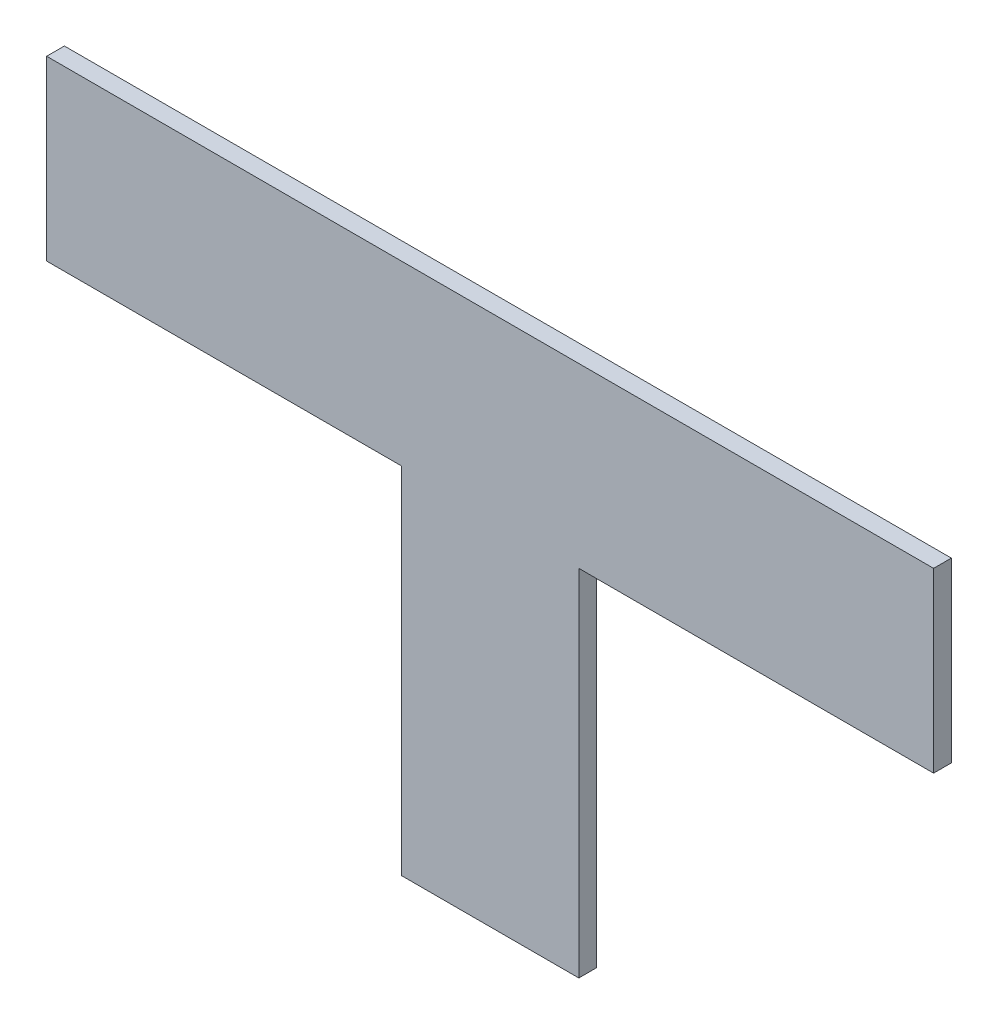
ISO-10303-21;
HEADER;
FILE_DESCRIPTION(('STEP AP214'),'2;1');
FILE_NAME('part.step','',(''),(''),'','','');
FILE_SCHEMA(('AUTOMOTIVE_DESIGN { 1 0 10303 214 1 1 1 1 }'));
ENDSEC;
DATA;
#1=APPLICATION_CONTEXT('core data for automotive mechanical design processes');
#2=APPLICATION_PROTOCOL_DEFINITION('international standard','automotive_design',2000,#1);
#3=PRODUCT_CONTEXT('',#1,'mechanical');
#4=PRODUCT('Part','Part','',(#3));
#5=PRODUCT_RELATED_PRODUCT_CATEGORY('part','',(#4));
#6=PRODUCT_DEFINITION_FORMATION('','',#4);
#7=PRODUCT_DEFINITION_CONTEXT('part definition',#1,'design');
#8=PRODUCT_DEFINITION('design','',#6,#7);
#9=PRODUCT_DEFINITION_SHAPE('','',#8);
#10=(LENGTH_UNIT() NAMED_UNIT(*) SI_UNIT(.MILLI.,.METRE.));
#11=(NAMED_UNIT(*) PLANE_ANGLE_UNIT() SI_UNIT($,.RADIAN.));
#12=(NAMED_UNIT(*) SI_UNIT($,.STERADIAN.) SOLID_ANGLE_UNIT());
#13=UNCERTAINTY_MEASURE_WITH_UNIT(LENGTH_MEASURE(1.E-05),#10,'distance_accuracy_value','');
#14=(GEOMETRIC_REPRESENTATION_CONTEXT(3) GLOBAL_UNCERTAINTY_ASSIGNED_CONTEXT((#13)) GLOBAL_UNIT_ASSIGNED_CONTEXT((#10,
#11,#12)) REPRESENTATION_CONTEXT('',''));
#15=CARTESIAN_POINT('',(0.,0.,0.));
#16=DIRECTION('',(0.,0.,1.));
#17=DIRECTION('',(1.,0.,0.));
#18=AXIS2_PLACEMENT_3D('',#15,#16,#17);
#19=CARTESIAN_POINT('',(50.,0.,2.));
#20=DIRECTION('',(1.,0.,0.));
#21=DIRECTION('',(0.,0.,-1.));
#22=AXIS2_PLACEMENT_3D('',#19,#20,#21);
#23=PLANE('',#22);
#24=DIRECTION('',(0.,-1.,0.));
#25=VECTOR('',#24,1.);
#26=CARTESIAN_POINT('',(50.,0.,0.));
#27=LINE('',#26,#25);
#28=CARTESIAN_POINT('',(50.,40.,0.));
#29=VERTEX_POINT('',#28);
#30=CARTESIAN_POINT('',(50.,20.,0.));
#31=VERTEX_POINT('',#30);
#32=EDGE_CURVE('E136',#29,#31,#27,.T.);
#33=ORIENTED_EDGE('',*,*,#32,.F.);
#34=DIRECTION('',(0.,0.,-1.));
#35=VECTOR('',#34,1.);
#36=CARTESIAN_POINT('',(50.,40.,2.));
#37=LINE('',#36,#35);
#38=CARTESIAN_POINT('',(50.,40.,2.));
#39=VERTEX_POINT('',#38);
#40=EDGE_CURVE('E11',#39,#29,#37,.T.);
#41=ORIENTED_EDGE('',*,*,#40,.F.);
#42=DIRECTION('',(0.,-1.,0.));
#43=VECTOR('',#42,1.);
#44=CARTESIAN_POINT('',(50.,0.,2.));
#45=LINE('',#44,#43);
#46=CARTESIAN_POINT('',(50.,20.,2.));
#47=VERTEX_POINT('',#46);
#48=EDGE_CURVE('E191',#39,#47,#45,.T.);
#49=ORIENTED_EDGE('',*,*,#48,.T.);
#50=DIRECTION('',(0.,0.,-1.));
#51=VECTOR('',#50,1.);
#52=CARTESIAN_POINT('',(50.,20.,2.));
#53=LINE('',#52,#51);
#54=EDGE_CURVE('E91',#47,#31,#53,.T.);
#55=ORIENTED_EDGE('',*,*,#54,.T.);
#56=EDGE_LOOP('',(#33,#41,#49,#55));
#57=FACE_BOUND('',#56,.T.);
#58=ADVANCED_FACE('F39',(#57),#23,.T.);
#59=CARTESIAN_POINT('',(0.,40.,2.));
#60=DIRECTION('',(0.,1.,0.));
#61=DIRECTION('',(0.,0.,1.));
#62=AXIS2_PLACEMENT_3D('',#59,#60,#61);
#63=PLANE('',#62);
#64=DIRECTION('',(1.,0.,0.));
#65=VECTOR('',#64,1.);
#66=CARTESIAN_POINT('',(0.,40.,0.));
#67=LINE('',#66,#65);
#68=CARTESIAN_POINT('',(-50.,40.,0.));
#69=VERTEX_POINT('',#68);
#70=EDGE_CURVE('E140',#69,#29,#67,.T.);
#71=ORIENTED_EDGE('',*,*,#70,.F.);
#72=DIRECTION('',(0.,0.,-1.));
#73=VECTOR('',#72,1.);
#74=CARTESIAN_POINT('',(-50.,40.,2.));
#75=LINE('',#74,#73);
#76=CARTESIAN_POINT('',(-50.,40.,2.));
#77=VERTEX_POINT('',#76);
#78=EDGE_CURVE('E48',#77,#69,#75,.T.);
#79=ORIENTED_EDGE('',*,*,#78,.F.);
#80=DIRECTION('',(1.,0.,0.));
#81=VECTOR('',#80,1.);
#82=CARTESIAN_POINT('',(0.,40.,2.));
#83=LINE('',#82,#81);
#84=EDGE_CURVE('E187',#77,#39,#83,.T.);
#85=ORIENTED_EDGE('',*,*,#84,.T.);
#86=ORIENTED_EDGE('',*,*,#40,.T.);
#87=EDGE_LOOP('',(#71,#79,#85,#86));
#88=FACE_BOUND('',#87,.T.);
#89=ADVANCED_FACE('F186',(#88),#63,.T.);
#90=CARTESIAN_POINT('',(-50.,0.,2.));
#91=DIRECTION('',(1.,0.,0.));
#92=DIRECTION('',(0.,0.,-1.));
#93=AXIS2_PLACEMENT_3D('',#90,#91,#92);
#94=PLANE('',#93);
#95=DIRECTION('',(0.,-1.,0.));
#96=VECTOR('',#95,1.);
#97=CARTESIAN_POINT('',(-50.,0.,0.));
#98=LINE('',#97,#96);
#99=CARTESIAN_POINT('',(-50.,20.,0.));
#100=VERTEX_POINT('',#99);
#101=EDGE_CURVE('E144',#69,#100,#98,.T.);
#102=ORIENTED_EDGE('',*,*,#101,.T.);
#103=DIRECTION('',(0.,0.,-1.));
#104=VECTOR('',#103,1.);
#105=CARTESIAN_POINT('',(-50.,20.,2.));
#106=LINE('',#105,#104);
#107=CARTESIAN_POINT('',(-50.,20.,2.));
#108=VERTEX_POINT('',#107);
#109=EDGE_CURVE('E169',#108,#100,#106,.T.);
#110=ORIENTED_EDGE('',*,*,#109,.F.);
#111=DIRECTION('',(0.,-1.,0.));
#112=VECTOR('',#111,1.);
#113=CARTESIAN_POINT('',(-50.,0.,2.));
#114=LINE('',#113,#112);
#115=EDGE_CURVE('E178',#77,#108,#114,.T.);
#116=ORIENTED_EDGE('',*,*,#115,.F.);
#117=ORIENTED_EDGE('',*,*,#78,.T.);
#118=EDGE_LOOP('',(#102,#110,#116,#117));
#119=FACE_BOUND('',#118,.T.);
#120=ADVANCED_FACE('F176',(#119),#94,.F.);
#121=CARTESIAN_POINT('',(0.,20.,2.));
#122=DIRECTION('',(0.,1.,0.));
#123=DIRECTION('',(0.,0.,1.));
#124=AXIS2_PLACEMENT_3D('',#121,#122,#123);
#125=PLANE('',#124);
#126=DIRECTION('',(1.,0.,0.));
#127=VECTOR('',#126,1.);
#128=CARTESIAN_POINT('',(0.,20.,0.));
#129=LINE('',#128,#127);
#130=CARTESIAN_POINT('',(-10.,20.,0.));
#131=VERTEX_POINT('',#130);
#132=EDGE_CURVE('E147',#100,#131,#129,.T.);
#133=ORIENTED_EDGE('',*,*,#132,.T.);
#134=DIRECTION('',(0.,0.,-1.));
#135=VECTOR('',#134,1.);
#136=CARTESIAN_POINT('',(-10.,20.,2.));
#137=LINE('',#136,#135);
#138=CARTESIAN_POINT('',(-10.,20.,2.));
#139=VERTEX_POINT('',#138);
#140=EDGE_CURVE('E166',#139,#131,#137,.T.);
#141=ORIENTED_EDGE('',*,*,#140,.F.);
#142=DIRECTION('',(1.,0.,0.));
#143=VECTOR('',#142,1.);
#144=CARTESIAN_POINT('',(0.,20.,2.));
#145=LINE('',#144,#143);
#146=EDGE_CURVE('E133',#108,#139,#145,.T.);
#147=ORIENTED_EDGE('',*,*,#146,.F.);
#148=ORIENTED_EDGE('',*,*,#109,.T.);
#149=EDGE_LOOP('',(#133,#141,#147,#148));
#150=FACE_BOUND('',#149,.T.);
#151=ADVANCED_FACE('F206',(#150),#125,.F.);
#152=CARTESIAN_POINT('',(-10.,0.,2.));
#153=DIRECTION('',(-1.,0.,0.));
#154=DIRECTION('',(0.,0.,1.));
#155=AXIS2_PLACEMENT_3D('',#152,#153,#154);
#156=PLANE('',#155);
#157=DIRECTION('',(0.,1.,0.));
#158=VECTOR('',#157,1.);
#159=CARTESIAN_POINT('',(-10.,0.,0.));
#160=LINE('',#159,#158);
#161=CARTESIAN_POINT('',(-10.,-20.,0.));
#162=VERTEX_POINT('',#161);
#163=EDGE_CURVE('E151',#162,#131,#160,.T.);
#164=ORIENTED_EDGE('',*,*,#163,.F.);
#165=DIRECTION('',(0.,0.,-1.));
#166=VECTOR('',#165,1.);
#167=CARTESIAN_POINT('',(-10.,-20.,2.));
#168=LINE('',#167,#166);
#169=CARTESIAN_POINT('',(-10.,-20.,2.));
#170=VERTEX_POINT('',#169);
#171=EDGE_CURVE('E125',#170,#162,#168,.T.);
#172=ORIENTED_EDGE('',*,*,#171,.F.);
#173=DIRECTION('',(0.,1.,0.));
#174=VECTOR('',#173,1.);
#175=CARTESIAN_POINT('',(-10.,0.,2.));
#176=LINE('',#175,#174);
#177=EDGE_CURVE('E116',#170,#139,#176,.T.);
#178=ORIENTED_EDGE('',*,*,#177,.T.);
#179=ORIENTED_EDGE('',*,*,#140,.T.);
#180=EDGE_LOOP('',(#164,#172,#178,#179));
#181=FACE_BOUND('',#180,.T.);
#182=ADVANCED_FACE('F202',(#181),#156,.T.);
#183=CARTESIAN_POINT('',(0.,-20.,2.));
#184=DIRECTION('',(0.,1.,0.));
#185=DIRECTION('',(0.,0.,1.));
#186=AXIS2_PLACEMENT_3D('',#183,#184,#185);
#187=PLANE('',#186);
#188=DIRECTION('',(1.,0.,0.));
#189=VECTOR('',#188,1.);
#190=CARTESIAN_POINT('',(0.,-20.,0.));
#191=LINE('',#190,#189);
#192=CARTESIAN_POINT('',(10.,-20.,0.));
#193=VERTEX_POINT('',#192);
#194=EDGE_CURVE('E123',#162,#193,#191,.T.);
#195=ORIENTED_EDGE('',*,*,#194,.T.);
#196=DIRECTION('',(0.,0.,-1.));
#197=VECTOR('',#196,1.);
#198=CARTESIAN_POINT('',(10.,-20.,2.));
#199=LINE('',#198,#197);
#200=CARTESIAN_POINT('',(10.,-20.,2.));
#201=VERTEX_POINT('',#200);
#202=EDGE_CURVE('E120',#201,#193,#199,.T.);
#203=ORIENTED_EDGE('',*,*,#202,.F.);
#204=DIRECTION('',(1.,0.,0.));
#205=VECTOR('',#204,1.);
#206=CARTESIAN_POINT('',(0.,-20.,2.));
#207=LINE('',#206,#205);
#208=EDGE_CURVE('E110',#170,#201,#207,.T.);
#209=ORIENTED_EDGE('',*,*,#208,.F.);
#210=ORIENTED_EDGE('',*,*,#171,.T.);
#211=EDGE_LOOP('',(#195,#203,#209,#210));
#212=FACE_BOUND('',#211,.T.);
#213=ADVANCED_FACE('F121',(#212),#187,.F.);
#214=CARTESIAN_POINT('',(10.,0.,2.));
#215=DIRECTION('',(-1.,0.,0.));
#216=DIRECTION('',(0.,0.,1.));
#217=AXIS2_PLACEMENT_3D('',#214,#215,#216);
#218=PLANE('',#217);
#219=DIRECTION('',(0.,1.,0.));
#220=VECTOR('',#219,1.);
#221=CARTESIAN_POINT('',(10.,0.,0.));
#222=LINE('',#221,#220);
#223=CARTESIAN_POINT('',(10.,20.,0.));
#224=VERTEX_POINT('',#223);
#225=EDGE_CURVE('E84',#193,#224,#222,.T.);
#226=ORIENTED_EDGE('',*,*,#225,.T.);
#227=DIRECTION('',(0.,0.,-1.));
#228=VECTOR('',#227,1.);
#229=CARTESIAN_POINT('',(10.,20.,2.));
#230=LINE('',#229,#228);
#231=CARTESIAN_POINT('',(10.,20.,2.));
#232=VERTEX_POINT('',#231);
#233=EDGE_CURVE('E126',#232,#224,#230,.T.);
#234=ORIENTED_EDGE('',*,*,#233,.F.);
#235=DIRECTION('',(0.,1.,0.));
#236=VECTOR('',#235,1.);
#237=CARTESIAN_POINT('',(10.,0.,2.));
#238=LINE('',#237,#236);
#239=EDGE_CURVE('E114',#201,#232,#238,.T.);
#240=ORIENTED_EDGE('',*,*,#239,.F.);
#241=ORIENTED_EDGE('',*,*,#202,.T.);
#242=EDGE_LOOP('',(#226,#234,#240,#241));
#243=FACE_BOUND('',#242,.T.);
#244=ADVANCED_FACE('F128',(#243),#218,.F.);
#245=EDGE_CURVE('E152',#224,#31,#129,.T.);
#246=ORIENTED_EDGE('',*,*,#245,.T.);
#247=ORIENTED_EDGE('',*,*,#54,.F.);
#248=EDGE_CURVE('E56',#232,#47,#145,.T.);
#249=ORIENTED_EDGE('',*,*,#248,.F.);
#250=ORIENTED_EDGE('',*,*,#233,.T.);
#251=EDGE_LOOP('',(#246,#247,#249,#250));
#252=FACE_BOUND('',#251,.T.);
#253=ADVANCED_FACE('F209',(#252),#125,.F.);
#254=CARTESIAN_POINT('',(0.,0.,2.));
#255=DIRECTION('',(0.,0.,1.));
#256=DIRECTION('',(1.,0.,0.));
#257=AXIS2_PLACEMENT_3D('',#254,#255,#256);
#258=PLANE('',#257);
#259=ORIENTED_EDGE('',*,*,#48,.F.);
#260=ORIENTED_EDGE('',*,*,#84,.F.);
#261=ORIENTED_EDGE('',*,*,#115,.T.);
#262=ORIENTED_EDGE('',*,*,#146,.T.);
#263=ORIENTED_EDGE('',*,*,#177,.F.);
#264=ORIENTED_EDGE('',*,*,#208,.T.);
#265=ORIENTED_EDGE('',*,*,#239,.T.);
#266=ORIENTED_EDGE('',*,*,#248,.T.);
#267=EDGE_LOOP('',(#259,#260,#261,#262,#263,#264,#265,#266));
#268=FACE_BOUND('',#267,.T.);
#269=ADVANCED_FACE('F112',(#268),#258,.T.);
#270=CARTESIAN_POINT('',(0.,0.,0.));
#271=DIRECTION('',(0.,0.,1.));
#272=DIRECTION('',(1.,0.,0.));
#273=AXIS2_PLACEMENT_3D('',#270,#271,#272);
#274=PLANE('',#273);
#275=ORIENTED_EDGE('',*,*,#32,.T.);
#276=ORIENTED_EDGE('',*,*,#245,.F.);
#277=ORIENTED_EDGE('',*,*,#225,.F.);
#278=ORIENTED_EDGE('',*,*,#194,.F.);
#279=ORIENTED_EDGE('',*,*,#163,.T.);
#280=ORIENTED_EDGE('',*,*,#132,.F.);
#281=ORIENTED_EDGE('',*,*,#101,.F.);
#282=ORIENTED_EDGE('',*,*,#70,.T.);
#283=EDGE_LOOP('',(#275,#276,#277,#278,#279,#280,#281,#282));
#284=FACE_BOUND('',#283,.T.);
#285=ADVANCED_FACE('F185',(#284),#274,.F.);
#286=CLOSED_SHELL('',(#58,#89,#120,#151,#182,#213,#244,#253,#269,#285));
#287=MANIFOLD_SOLID_BREP('B2',#286);
#288=ADVANCED_BREP_SHAPE_REPRESENTATION('',(#18,#287),#14);
#289=SHAPE_DEFINITION_REPRESENTATION(#9,#288);
ENDSEC;
END-ISO-10303-21;
